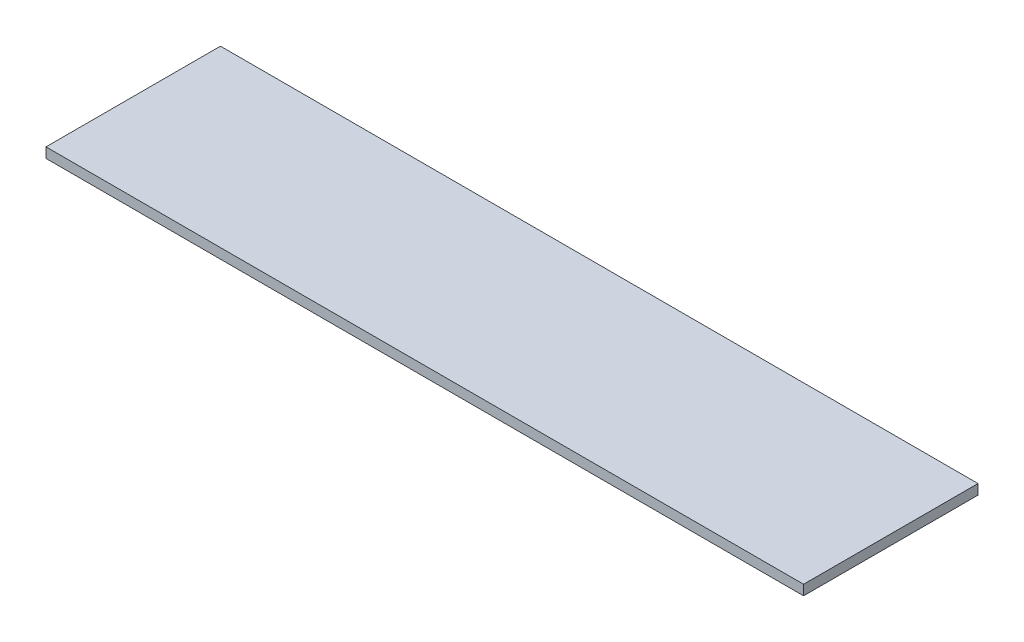
ISO-10303-21;
HEADER;
FILE_DESCRIPTION(('STEP AP214'),'2;1');
FILE_NAME('part.step','',(''),(''),'','','');
FILE_SCHEMA(('AUTOMOTIVE_DESIGN { 1 0 10303 214 1 1 1 1 }'));
ENDSEC;
DATA;
#1=APPLICATION_CONTEXT('core data for automotive mechanical design processes');
#2=APPLICATION_PROTOCOL_DEFINITION('international standard','automotive_design',2000,#1);
#3=PRODUCT_CONTEXT('',#1,'mechanical');
#4=PRODUCT('Part','Part','',(#3));
#5=PRODUCT_RELATED_PRODUCT_CATEGORY('part','',(#4));
#6=PRODUCT_DEFINITION_FORMATION('','',#4);
#7=PRODUCT_DEFINITION_CONTEXT('part definition',#1,'design');
#8=PRODUCT_DEFINITION('design','',#6,#7);
#9=PRODUCT_DEFINITION_SHAPE('','',#8);
#10=(LENGTH_UNIT() NAMED_UNIT(*) SI_UNIT(.MILLI.,.METRE.));
#11=(NAMED_UNIT(*) PLANE_ANGLE_UNIT() SI_UNIT($,.RADIAN.));
#12=(NAMED_UNIT(*) SI_UNIT($,.STERADIAN.) SOLID_ANGLE_UNIT());
#13=UNCERTAINTY_MEASURE_WITH_UNIT(LENGTH_MEASURE(1.E-05),#10,'distance_accuracy_value','');
#14=(GEOMETRIC_REPRESENTATION_CONTEXT(3) GLOBAL_UNCERTAINTY_ASSIGNED_CONTEXT((#13)) GLOBAL_UNIT_ASSIGNED_CONTEXT((#10,
#11,#12)) REPRESENTATION_CONTEXT('',''));
#15=CARTESIAN_POINT('',(0.,0.,0.));
#16=DIRECTION('',(0.,0.,1.));
#17=DIRECTION('',(1.,0.,0.));
#18=AXIS2_PLACEMENT_3D('',#15,#16,#17);
#19=CARTESIAN_POINT('',(75.35,2.,-17.35));
#20=DIRECTION('',(-1.,0.,0.));
#21=DIRECTION('',(0.,0.,1.));
#22=AXIS2_PLACEMENT_3D('',#19,#20,#21);
#23=PLANE('',#22);
#24=DIRECTION('',(0.,0.,-1.));
#25=VECTOR('',#24,1.);
#26=CARTESIAN_POINT('',(75.35,0.,-17.35));
#27=LINE('',#26,#25);
#28=CARTESIAN_POINT('',(75.35,0.,17.35));
#29=VERTEX_POINT('',#28);
#30=CARTESIAN_POINT('',(75.35,0.,-17.35));
#31=VERTEX_POINT('',#30);
#32=EDGE_CURVE('E98',#29,#31,#27,.T.);
#33=ORIENTED_EDGE('',*,*,#32,.T.);
#34=DIRECTION('',(0.,-1.,0.));
#35=VECTOR('',#34,1.);
#36=CARTESIAN_POINT('',(75.35,2.,-17.35));
#37=LINE('',#36,#35);
#38=CARTESIAN_POINT('',(75.35,2.,-17.35));
#39=VERTEX_POINT('',#38);
#40=EDGE_CURVE('E11',#39,#31,#37,.T.);
#41=ORIENTED_EDGE('',*,*,#40,.F.);
#42=DIRECTION('',(0.,0.,-1.));
#43=VECTOR('',#42,1.);
#44=CARTESIAN_POINT('',(75.35,2.,-17.35));
#45=LINE('',#44,#43);
#46=CARTESIAN_POINT('',(75.35,2.,17.35));
#47=VERTEX_POINT('',#46);
#48=EDGE_CURVE('E86',#47,#39,#45,.T.);
#49=ORIENTED_EDGE('',*,*,#48,.F.);
#50=DIRECTION('',(0.,-1.,0.));
#51=VECTOR('',#50,1.);
#52=CARTESIAN_POINT('',(75.35,2.,17.35));
#53=LINE('',#52,#51);
#54=EDGE_CURVE('E94',#47,#29,#53,.T.);
#55=ORIENTED_EDGE('',*,*,#54,.T.);
#56=EDGE_LOOP('',(#33,#41,#49,#55));
#57=FACE_BOUND('',#56,.T.);
#58=ADVANCED_FACE('F35',(#57),#23,.F.);
#59=CARTESIAN_POINT('',(-75.35,2.,-17.35));
#60=DIRECTION('',(0.,0.,1.));
#61=DIRECTION('',(1.,0.,0.));
#62=AXIS2_PLACEMENT_3D('',#59,#60,#61);
#63=PLANE('',#62);
#64=DIRECTION('',(-1.,0.,0.));
#65=VECTOR('',#64,1.);
#66=CARTESIAN_POINT('',(-75.35,0.,-17.35));
#67=LINE('',#66,#65);
#68=CARTESIAN_POINT('',(-75.35,0.,-17.35));
#69=VERTEX_POINT('',#68);
#70=EDGE_CURVE('E90',#31,#69,#67,.T.);
#71=ORIENTED_EDGE('',*,*,#70,.T.);
#72=DIRECTION('',(0.,-1.,0.));
#73=VECTOR('',#72,1.);
#74=CARTESIAN_POINT('',(-75.35,2.,-17.35));
#75=LINE('',#74,#73);
#76=CARTESIAN_POINT('',(-75.35,2.,-17.35));
#77=VERTEX_POINT('',#76);
#78=EDGE_CURVE('E43',#77,#69,#75,.T.);
#79=ORIENTED_EDGE('',*,*,#78,.F.);
#80=DIRECTION('',(-1.,0.,0.));
#81=VECTOR('',#80,1.);
#82=CARTESIAN_POINT('',(-75.35,2.,-17.35));
#83=LINE('',#82,#81);
#84=EDGE_CURVE('E81',#39,#77,#83,.T.);
#85=ORIENTED_EDGE('',*,*,#84,.F.);
#86=ORIENTED_EDGE('',*,*,#40,.T.);
#87=EDGE_LOOP('',(#71,#79,#85,#86));
#88=FACE_BOUND('',#87,.T.);
#89=ADVANCED_FACE('F89',(#88),#63,.F.);
#90=CARTESIAN_POINT('',(-75.35,2.,-17.35));
#91=DIRECTION('',(1.,0.,0.));
#92=DIRECTION('',(0.,0.,-1.));
#93=AXIS2_PLACEMENT_3D('',#90,#91,#92);
#94=PLANE('',#93);
#95=DIRECTION('',(0.,0.,1.));
#96=VECTOR('',#95,1.);
#97=CARTESIAN_POINT('',(-75.35,0.,-17.35));
#98=LINE('',#97,#96);
#99=CARTESIAN_POINT('',(-75.35,0.,17.35));
#100=VERTEX_POINT('',#99);
#101=EDGE_CURVE('E68',#69,#100,#98,.T.);
#102=ORIENTED_EDGE('',*,*,#101,.T.);
#103=DIRECTION('',(0.,-1.,0.));
#104=VECTOR('',#103,1.);
#105=CARTESIAN_POINT('',(-75.35,2.,17.35));
#106=LINE('',#105,#104);
#107=CARTESIAN_POINT('',(-75.35,2.,17.35));
#108=VERTEX_POINT('',#107);
#109=EDGE_CURVE('E91',#108,#100,#106,.T.);
#110=ORIENTED_EDGE('',*,*,#109,.F.);
#111=DIRECTION('',(0.,0.,1.));
#112=VECTOR('',#111,1.);
#113=CARTESIAN_POINT('',(-75.35,2.,-17.35));
#114=LINE('',#113,#112);
#115=EDGE_CURVE('E84',#77,#108,#114,.T.);
#116=ORIENTED_EDGE('',*,*,#115,.F.);
#117=ORIENTED_EDGE('',*,*,#78,.T.);
#118=EDGE_LOOP('',(#102,#110,#116,#117));
#119=FACE_BOUND('',#118,.T.);
#120=ADVANCED_FACE('F92',(#119),#94,.F.);
#121=CARTESIAN_POINT('',(-75.35,2.,17.35));
#122=DIRECTION('',(0.,0.,-1.));
#123=DIRECTION('',(-1.,0.,0.));
#124=AXIS2_PLACEMENT_3D('',#121,#122,#123);
#125=PLANE('',#124);
#126=DIRECTION('',(1.,0.,0.));
#127=VECTOR('',#126,1.);
#128=CARTESIAN_POINT('',(-75.35,0.,17.35));
#129=LINE('',#128,#127);
#130=EDGE_CURVE('E74',#100,#29,#129,.T.);
#131=ORIENTED_EDGE('',*,*,#130,.T.);
#132=ORIENTED_EDGE('',*,*,#54,.F.);
#133=DIRECTION('',(1.,0.,0.));
#134=VECTOR('',#133,1.);
#135=CARTESIAN_POINT('',(-75.35,2.,17.35));
#136=LINE('',#135,#134);
#137=EDGE_CURVE('E51',#108,#47,#136,.T.);
#138=ORIENTED_EDGE('',*,*,#137,.F.);
#139=ORIENTED_EDGE('',*,*,#109,.T.);
#140=EDGE_LOOP('',(#131,#132,#138,#139));
#141=FACE_BOUND('',#140,.T.);
#142=ADVANCED_FACE('F105',(#141),#125,.F.);
#143=CARTESIAN_POINT('',(0.,2.,0.));
#144=DIRECTION('',(0.,1.,0.));
#145=DIRECTION('',(0.,0.,1.));
#146=AXIS2_PLACEMENT_3D('',#143,#144,#145);
#147=PLANE('',#146);
#148=ORIENTED_EDGE('',*,*,#48,.T.);
#149=ORIENTED_EDGE('',*,*,#84,.T.);
#150=ORIENTED_EDGE('',*,*,#115,.T.);
#151=ORIENTED_EDGE('',*,*,#137,.T.);
#152=EDGE_LOOP('',(#148,#149,#150,#151));
#153=FACE_BOUND('',#152,.T.);
#154=ADVANCED_FACE('F82',(#153),#147,.T.);
#155=CARTESIAN_POINT('',(0.,0.,0.));
#156=DIRECTION('',(0.,1.,0.));
#157=DIRECTION('',(0.,0.,1.));
#158=AXIS2_PLACEMENT_3D('',#155,#156,#157);
#159=PLANE('',#158);
#160=ORIENTED_EDGE('',*,*,#32,.F.);
#161=ORIENTED_EDGE('',*,*,#130,.F.);
#162=ORIENTED_EDGE('',*,*,#101,.F.);
#163=ORIENTED_EDGE('',*,*,#70,.F.);
#164=EDGE_LOOP('',(#160,#161,#162,#163));
#165=FACE_BOUND('',#164,.T.);
#166=ADVANCED_FACE('F108',(#165),#159,.F.);
#167=CLOSED_SHELL('',(#58,#89,#120,#142,#154,#166));
#168=MANIFOLD_SOLID_BREP('B2',#167);
#169=ADVANCED_BREP_SHAPE_REPRESENTATION('',(#18,#168),#14);
#170=SHAPE_DEFINITION_REPRESENTATION(#9,#169);
ENDSEC;
END-ISO-10303-21;
